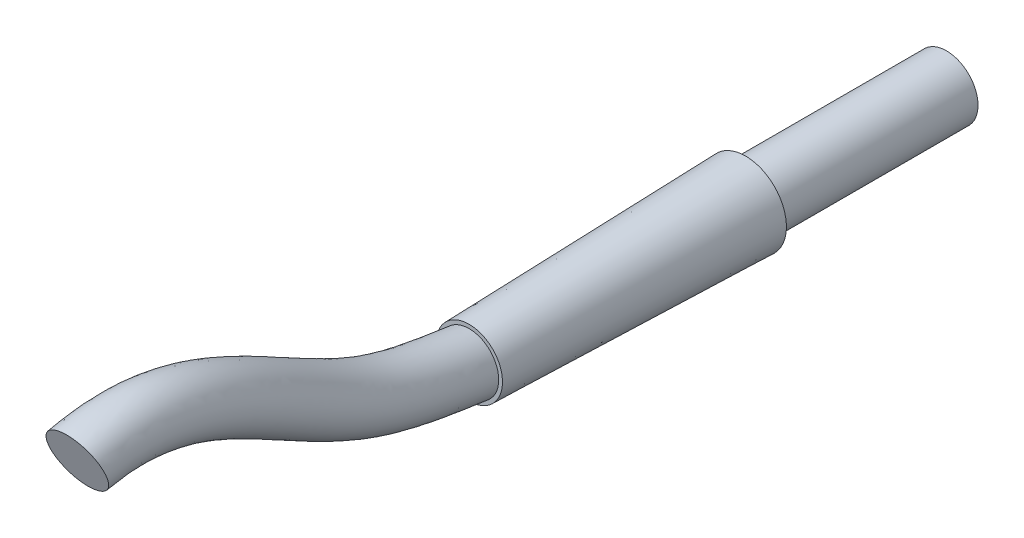
ISO-10303-21;
HEADER;
FILE_DESCRIPTION(('STEP AP214'),'2;1');
FILE_NAME('part.step','',(''),(''),'','','');
FILE_SCHEMA(('AUTOMOTIVE_DESIGN { 1 0 10303 214 1 1 1 1 }'));
ENDSEC;
DATA;
#1=APPLICATION_CONTEXT('core data for automotive mechanical design processes');
#2=APPLICATION_PROTOCOL_DEFINITION('international standard','automotive_design',2000,#1);
#3=PRODUCT_CONTEXT('',#1,'mechanical');
#4=PRODUCT('Part','Part','',(#3));
#5=PRODUCT_RELATED_PRODUCT_CATEGORY('part','',(#4));
#6=PRODUCT_DEFINITION_FORMATION('','',#4);
#7=PRODUCT_DEFINITION_CONTEXT('part definition',#1,'design');
#8=PRODUCT_DEFINITION('design','',#6,#7);
#9=PRODUCT_DEFINITION_SHAPE('','',#8);
#10=(LENGTH_UNIT() NAMED_UNIT(*) SI_UNIT(.MILLI.,.METRE.));
#11=(NAMED_UNIT(*) PLANE_ANGLE_UNIT() SI_UNIT($,.RADIAN.));
#12=(NAMED_UNIT(*) SI_UNIT($,.STERADIAN.) SOLID_ANGLE_UNIT());
#13=UNCERTAINTY_MEASURE_WITH_UNIT(LENGTH_MEASURE(1.E-05),#10,'distance_accuracy_value','');
#14=(GEOMETRIC_REPRESENTATION_CONTEXT(3) GLOBAL_UNCERTAINTY_ASSIGNED_CONTEXT((#13)) GLOBAL_UNIT_ASSIGNED_CONTEXT((#10,
#11,#12)) REPRESENTATION_CONTEXT('',''));
#15=CARTESIAN_POINT('',(0.,0.,0.));
#16=DIRECTION('',(0.,0.,1.));
#17=DIRECTION('',(1.,0.,0.));
#18=AXIS2_PLACEMENT_3D('',#15,#16,#17);
#19=CARTESIAN_POINT('',(0.,0.,0.));
#20=DIRECTION('',(0.,0.,1.));
#21=DIRECTION('',(1.,0.,0.));
#22=AXIS2_PLACEMENT_3D('',#19,#20,#21);
#23=PLANE('',#22);
#24=CARTESIAN_POINT('',(0.,0.,0.));
#25=DIRECTION('',(0.,0.,1.));
#26=DIRECTION('',(1.,0.,0.));
#27=AXIS2_PLACEMENT_3D('',#24,#25,#26);
#28=CIRCLE('',#27,2.5);
#29=CARTESIAN_POINT('',(2.5,0.,0.));
#30=VERTEX_POINT('',#29);
#31=EDGE_CURVE('E40',#30,#30,#28,.T.);
#32=ORIENTED_EDGE('',*,*,#31,.F.);
#33=EDGE_LOOP('',(#32));
#34=FACE_BOUND('',#33,.T.);
#35=CARTESIAN_POINT('',(0.,0.,0.));
#36=DIRECTION('',(0.,0.,1.));
#37=DIRECTION('',(1.,0.,0.));
#38=AXIS2_PLACEMENT_3D('',#35,#36,#37);
#39=CIRCLE('',#38,1.3);
#40=CARTESIAN_POINT('',(1.3,0.,0.));
#41=VERTEX_POINT('',#40);
#42=EDGE_CURVE('E63',#41,#41,#39,.T.);
#43=ORIENTED_EDGE('',*,*,#42,.T.);
#44=EDGE_LOOP('',(#43));
#45=FACE_BOUND('',#44,.T.);
#46=ADVANCED_FACE('F36',(#34,#45),#23,.F.);
#47=CARTESIAN_POINT('',(0.,0.,16.));
#48=DIRECTION('',(0.,0.,-1.));
#49=DIRECTION('',(-1.,0.,0.));
#50=AXIS2_PLACEMENT_3D('',#47,#48,#49);
#51=CYLINDRICAL_SURFACE('',#50,2.5);
#52=CARTESIAN_POINT('',(0.,0.,16.));
#53=DIRECTION('',(0.,0.,1.));
#54=DIRECTION('',(1.,0.,0.));
#55=AXIS2_PLACEMENT_3D('',#52,#53,#54);
#56=CIRCLE('',#55,2.5);
#57=CARTESIAN_POINT('',(2.5,0.,16.));
#58=VERTEX_POINT('',#57);
#59=EDGE_CURVE('E44',#58,#58,#56,.T.);
#60=ORIENTED_EDGE('',*,*,#59,.F.);
#61=EDGE_LOOP('',(#60));
#62=FACE_BOUND('',#61,.T.);
#63=ORIENTED_EDGE('',*,*,#31,.T.);
#64=EDGE_LOOP('',(#63));
#65=FACE_BOUND('',#64,.T.);
#66=ADVANCED_FACE('F38',(#62,#65),#51,.T.);
#67=CARTESIAN_POINT('',(0.,0.,16.));
#68=DIRECTION('',(0.,0.,-1.));
#69=DIRECTION('',(-1.,0.,0.));
#70=AXIS2_PLACEMENT_3D('',#67,#68,#69);
#71=CYLINDRICAL_SURFACE('',#70,1.3);
#72=CARTESIAN_POINT('',(0.,0.,16.));
#73=DIRECTION('',(0.,0.,1.));
#74=DIRECTION('',(1.,0.,0.));
#75=AXIS2_PLACEMENT_3D('',#72,#73,#74);
#76=CIRCLE('',#75,1.3);
#77=CARTESIAN_POINT('',(1.3,0.,16.));
#78=VERTEX_POINT('',#77);
#79=EDGE_CURVE('E60',#78,#78,#76,.T.);
#80=ORIENTED_EDGE('',*,*,#79,.T.);
#81=EDGE_LOOP('',(#80));
#82=FACE_BOUND('',#81,.T.);
#83=ORIENTED_EDGE('',*,*,#42,.F.);
#84=EDGE_LOOP('',(#83));
#85=FACE_BOUND('',#84,.T.);
#86=ADVANCED_FACE('F76',(#82,#85),#71,.F.);
#87=CARTESIAN_POINT('',(-3.25,0.,16.));
#88=DIRECTION('',(0.,0.,-1.));
#89=DIRECTION('',(-1.,0.,0.));
#90=AXIS2_PLACEMENT_3D('',#87,#88,#89);
#91=PLANE('',#90);
#92=ORIENTED_EDGE('',*,*,#79,.F.);
#93=EDGE_LOOP('',(#92));
#94=FACE_BOUND('',#93,.T.);
#95=ADVANCED_FACE('F78',(#94),#91,.T.);
#96=CARTESIAN_POINT('',(0.,0.,16.));
#97=DIRECTION('',(0.,0.,-1.));
#98=DIRECTION('',(-1.,0.,0.));
#99=AXIS2_PLACEMENT_3D('',#96,#97,#98);
#100=CONICAL_SURFACE('',#99,3.25,0.0272659684555946);
#101=CARTESIAN_POINT('',(0.,0.,38.));
#102=DIRECTION('',(0.,0.,-1.));
#103=DIRECTION('',(-1.,0.,0.));
#104=AXIS2_PLACEMENT_3D('',#101,#102,#103);
#105=CIRCLE('',#104,2.65);
#106=CARTESIAN_POINT('',(-2.65,0.,38.));
#107=VERTEX_POINT('',#106);
#108=EDGE_CURVE('E55',#107,#107,#105,.T.);
#109=ORIENTED_EDGE('',*,*,#108,.T.);
#110=EDGE_LOOP('',(#109));
#111=FACE_BOUND('',#110,.T.);
#112=CARTESIAN_POINT('',(0.,0.,16.));
#113=DIRECTION('',(0.,0.,-1.));
#114=DIRECTION('',(-1.,0.,0.));
#115=AXIS2_PLACEMENT_3D('',#112,#113,#114);
#116=CIRCLE('',#115,3.25);
#117=CARTESIAN_POINT('',(-3.25,0.,16.));
#118=VERTEX_POINT('',#117);
#119=EDGE_CURVE('E52',#118,#118,#116,.T.);
#120=ORIENTED_EDGE('',*,*,#119,.F.);
#121=EDGE_LOOP('',(#120));
#122=FACE_BOUND('',#121,.T.);
#123=ADVANCED_FACE('F85',(#111,#122),#100,.T.);
#124=CARTESIAN_POINT('',(-2.65,0.,38.));
#125=DIRECTION('',(0.,0.,1.));
#126=DIRECTION('',(1.,0.,0.));
#127=AXIS2_PLACEMENT_3D('',#124,#125,#126);
#128=PLANE('',#127);
#129=CARTESIAN_POINT('',(0.,0.,38.));
#130=DIRECTION('',(0.,0.,1.));
#131=DIRECTION('',(1.,0.,0.));
#132=AXIS2_PLACEMENT_3D('',#129,#130,#131);
#133=CIRCLE('',#132,2.35);
#134=CARTESIAN_POINT('',(2.35,0.,38.));
#135=VERTEX_POINT('',#134);
#136=EDGE_CURVE('E11',#135,#135,#133,.T.);
#137=ORIENTED_EDGE('',*,*,#136,.F.);
#138=EDGE_LOOP('',(#137));
#139=FACE_BOUND('',#138,.T.);
#140=ORIENTED_EDGE('',*,*,#108,.F.);
#141=EDGE_LOOP('',(#140));
#142=FACE_BOUND('',#141,.T.);
#143=ADVANCED_FACE('F93',(#139,#142),#128,.T.);
#144=ORIENTED_EDGE('',*,*,#59,.T.);
#145=EDGE_LOOP('',(#144));
#146=FACE_BOUND('',#145,.T.);
#147=ORIENTED_EDGE('',*,*,#119,.T.);
#148=EDGE_LOOP('',(#147));
#149=FACE_BOUND('',#148,.T.);
#150=ADVANCED_FACE('F88',(#146,#149),#91,.T.);
#151=CARTESIAN_POINT('',(0.,8.85086370550425,69.1894640782778));
#152=DIRECTION('',(0.,-0.360850723516981,0.932623587165407));
#153=DIRECTION('',(1.,0.,0.));
#154=AXIS2_PLACEMENT_3D('',#151,#152,#153);
#155=PLANE('',#154);
#156=CARTESIAN_POINT('',(0.,8.85086370550425,69.1894640782778));
#157=DIRECTION('',(0.,-0.360850723516981,0.932623587165407));
#158=DIRECTION('',(1.,0.,0.));
#159=AXIS2_PLACEMENT_3D('',#156,#157,#158);
#160=CIRCLE('',#159,2.35);
#161=CARTESIAN_POINT('',(2.35,8.85086370550425,69.1894640782778));
#162=VERTEX_POINT('',#161);
#163=EDGE_CURVE('E49',#162,#162,#160,.T.);
#164=ORIENTED_EDGE('',*,*,#163,.T.);
#165=EDGE_LOOP('',(#164));
#166=FACE_BOUND('',#165,.T.);
#167=ADVANCED_FACE('F50',(#166),#155,.T.);
#168=CARTESIAN_POINT('',(2.35,0.,38.));
#169=CARTESIAN_POINT('',(2.35,0.382917685191229,40.6216539179695));
#170=CARTESIAN_POINT('',(2.35,0.786232130769165,43.3021867400378));
#171=CARTESIAN_POINT('',(2.35,2.28256281143762,47.7538832187834));
#172=CARTESIAN_POINT('',(2.35,3.19256337368808,49.5912434196371));
#173=CARTESIAN_POINT('',(2.35,5.1249927569069,53.224666097579));
#174=CARTESIAN_POINT('',(2.35,6.1474215868881,55.0207285715829));
#175=CARTESIAN_POINT('',(2.35,7.89569800640815,58.7188614697592));
#176=CARTESIAN_POINT('',(2.35,8.6215456067298,60.6209318900412));
#177=CARTESIAN_POINT('',(2.35,9.36765007133316,64.6783863530319));
#178=CARTESIAN_POINT('',(2.35,9.38790694197741,66.8337703935628));
#179=CARTESIAN_POINT('',(2.35,8.85086370550425,69.1894640782778));
#180=CARTESIAN_POINT('',(2.35,4.7,38.));
#181=CARTESIAN_POINT('',(2.35,5.08291768526592,40.6078490444321));
#182=CARTESIAN_POINT('',(2.35,5.51005527387265,43.0113651462809));
#183=CARTESIAN_POINT('',(2.35,6.8313070669288,46.4966923683273));
#184=CARTESIAN_POINT('',(2.35,7.64802369489255,48.0922321345955));
#185=CARTESIAN_POINT('',(2.35,9.51955679022571,51.5555440324687));
#186=CARTESIAN_POINT('',(2.35,10.5720711718513,53.4175695035891));
#187=CARTESIAN_POINT('',(2.35,12.4606774262897,57.5749183635968));
#188=CARTESIAN_POINT('',(2.35,13.2976775900972,59.8864420405353));
#189=CARTESIAN_POINT('',(2.35,14.0851472066207,65.0668531091491));
#190=CARTESIAN_POINT('',(2.35,14.0046750580061,67.9264470425132));
#191=CARTESIAN_POINT('',(2.35,13.2341945651817,70.8854624788076));
#192=CARTESIAN_POINT('',(-2.35,4.7,38.));
#193=CARTESIAN_POINT('',(-2.35,5.08291768526592,40.6078490444321));
#194=CARTESIAN_POINT('',(-2.35,5.51005527387265,43.0113651462809));
#195=CARTESIAN_POINT('',(-2.35,6.8313070669288,46.4966923683273));
#196=CARTESIAN_POINT('',(-2.35,7.64802369489255,48.0922321345955));
#197=CARTESIAN_POINT('',(-2.35,9.51955679022571,51.5555440324687));
#198=CARTESIAN_POINT('',(-2.35,10.5720711718513,53.4175695035891));
#199=CARTESIAN_POINT('',(-2.35,12.4606774262897,57.5749183635968));
#200=CARTESIAN_POINT('',(-2.35,13.2976775900972,59.8864420405353));
#201=CARTESIAN_POINT('',(-2.35,14.0851472066207,65.0668531091491));
#202=CARTESIAN_POINT('',(-2.35,14.0046750580061,67.9264470425132));
#203=CARTESIAN_POINT('',(-2.35,13.2341945651817,70.8854624788076));
#204=CARTESIAN_POINT('',(-2.35,0.,38.));
#205=CARTESIAN_POINT('',(-2.35,0.38291768519123,40.6216539179695));
#206=CARTESIAN_POINT('',(-2.35,0.786232130769165,43.3021867400378));
#207=CARTESIAN_POINT('',(-2.35,2.28256281143762,47.7538832187834));
#208=CARTESIAN_POINT('',(-2.35,3.19256337368808,49.5912434196371));
#209=CARTESIAN_POINT('',(-2.35,5.1249927569069,53.224666097579));
#210=CARTESIAN_POINT('',(-2.35,6.1474215868881,55.0207285715829));
#211=CARTESIAN_POINT('',(-2.35,7.89569800640815,58.7188614697592));
#212=CARTESIAN_POINT('',(-2.35,8.62154560672981,60.6209318900412));
#213=CARTESIAN_POINT('',(-2.35,9.36765007133316,64.6783863530319));
#214=CARTESIAN_POINT('',(-2.35,9.38790694197741,66.8337703935628));
#215=CARTESIAN_POINT('',(-2.35,8.85086370550425,69.1894640782778));
#216=CARTESIAN_POINT('',(-2.35,-4.7,38.));
#217=CARTESIAN_POINT('',(-2.35,-4.31708231488346,40.6354587915069));
#218=CARTESIAN_POINT('',(-2.35,-3.93759101233432,43.5930083337947));
#219=CARTESIAN_POINT('',(-2.35,-2.26618144405356,49.0110740692396));
#220=CARTESIAN_POINT('',(-2.35,-1.2628969475164,51.0902547046787));
#221=CARTESIAN_POINT('',(-2.35,0.730428723588086,54.8937881626893));
#222=CARTESIAN_POINT('',(-2.35,1.7227720019249,56.6238876395767));
#223=CARTESIAN_POINT('',(-2.35,3.33071858652657,59.8628045759215));
#224=CARTESIAN_POINT('',(-2.35,3.94541362336238,61.3554217395471));
#225=CARTESIAN_POINT('',(-2.35,4.65015293604565,64.2899195969146));
#226=CARTESIAN_POINT('',(-2.35,4.77113882594874,65.7410937446125));
#227=CARTESIAN_POINT('',(-2.35,4.46753284582684,67.4934656777479));
#228=CARTESIAN_POINT('',(2.35,-4.7,38.));
#229=CARTESIAN_POINT('',(2.35,-4.31708231488346,40.6354587915069));
#230=CARTESIAN_POINT('',(2.35,-3.93759101233432,43.5930083337947));
#231=CARTESIAN_POINT('',(2.35,-2.26618144405356,49.0110740692396));
#232=CARTESIAN_POINT('',(2.35,-1.2628969475164,51.0902547046787));
#233=CARTESIAN_POINT('',(2.35,0.730428723588086,54.8937881626893));
#234=CARTESIAN_POINT('',(2.35,1.7227720019249,56.6238876395767));
#235=CARTESIAN_POINT('',(2.35,3.33071858652657,59.8628045759215));
#236=CARTESIAN_POINT('',(2.35,3.94541362336238,61.3554217395471));
#237=CARTESIAN_POINT('',(2.35,4.65015293604565,64.2899195969146));
#238=CARTESIAN_POINT('',(2.35,4.77113882594874,65.7410937446125));
#239=CARTESIAN_POINT('',(2.35,4.46753284582684,67.4934656777479));
#240=CARTESIAN_POINT('',(2.35,0.,38.));
#241=CARTESIAN_POINT('',(2.35,0.382917685191229,40.6216539179695));
#242=CARTESIAN_POINT('',(2.35,0.786232130769165,43.3021867400378));
#243=CARTESIAN_POINT('',(2.35,2.28256281143762,47.7538832187834));
#244=CARTESIAN_POINT('',(2.35,3.19256337368808,49.5912434196371));
#245=CARTESIAN_POINT('',(2.35,5.1249927569069,53.224666097579));
#246=CARTESIAN_POINT('',(2.35,6.1474215868881,55.0207285715829));
#247=CARTESIAN_POINT('',(2.35,7.89569800640815,58.7188614697592));
#248=CARTESIAN_POINT('',(2.35,8.6215456067298,60.6209318900412));
#249=CARTESIAN_POINT('',(2.35,9.36765007133316,64.6783863530319));
#250=CARTESIAN_POINT('',(2.35,9.38790694197741,66.8337703935628));
#251=CARTESIAN_POINT('',(2.35,8.85086370550425,69.1894640782778));
#252=(BOUNDED_SURFACE() B_SPLINE_SURFACE(3,3,((#168,#169,#170,#171,#172,#173,#174,#175,#176,
#177,#178,#179),(#180,#181,#182,#183,#184,#185,#186,#187,#188,#189,#190,#191),(#192,#193,#194,
#195,#196,#197,#198,#199,#200,#201,#202,#203),(#204,#205,#206,#207,#208,#209,#210,#211,#212,
#213,#214,#215),(#216,#217,#218,#219,#220,#221,#222,#223,#224,#225,#226,#227),(#228,#229,#230,
#231,#232,#233,#234,#235,#236,#237,#238,#239),(#240,#241,#242,#243,#244,#245,#246,#247,#248,
#249,#250,#251)),.UNSPECIFIED.,.T.,.F.,.F.) B_SPLINE_SURFACE_WITH_KNOTS((4,3,4),(4,2,2,2,2,4),
(0.,0.5,1.),(0.,0.24593663918741,0.434452479390558,0.622968319593705,0.811484159796853,1.),
.UNSPECIFIED.) GEOMETRIC_REPRESENTATION_ITEM() RATIONAL_B_SPLINE_SURFACE(((1.,1.,1.,1.,1.,1.,1.,
1.,1.,1.,1.,1.),(0.333333333333333,0.333333333333333,0.333333333333333,0.333333333333333,
0.333333333333333,0.333333333333333,0.333333333333333,0.333333333333333,0.333333333333333,
0.333333333333333,0.333333333333333,0.333333333333333),(0.333333333333333,0.333333333333333,
0.333333333333333,0.333333333333333,0.333333333333333,0.333333333333333,0.333333333333333,
0.333333333333333,0.333333333333333,0.333333333333333,0.333333333333333,0.333333333333333),(1.,
1.,1.,1.,1.,1.,1.,1.,1.,1.,1.,1.),(0.333333333333333,0.333333333333333,0.333333333333333,
0.333333333333333,0.333333333333333,0.333333333333333,0.333333333333333,0.333333333333333,
0.333333333333333,0.333333333333333,0.333333333333333,0.333333333333333),(0.333333333333333,
0.333333333333333,0.333333333333333,0.333333333333333,0.333333333333333,0.333333333333333,
0.333333333333333,0.333333333333333,0.333333333333333,0.333333333333333,0.333333333333333,
0.333333333333333),(1.,1.,1.,1.,1.,1.,1.,1.,1.,1.,1.,1.))) REPRESENTATION_ITEM('') SURFACE());
#253=ORIENTED_EDGE('',*,*,#163,.F.);
#254=EDGE_LOOP('',(#253));
#255=FACE_BOUND('',#254,.T.);
#256=ORIENTED_EDGE('',*,*,#136,.T.);
#257=EDGE_LOOP('',(#256));
#258=FACE_BOUND('',#257,.T.);
#259=ADVANCED_FACE('F99',(#255,#258),#252,.T.);
#260=CLOSED_SHELL('',(#46,#66,#86,#95,#123,#143,#150,#167,#259));
#261=MANIFOLD_SOLID_BREP('B2',#260);
#262=ADVANCED_BREP_SHAPE_REPRESENTATION('',(#18,#261),#14);
#263=SHAPE_DEFINITION_REPRESENTATION(#9,#262);
ENDSEC;
END-ISO-10303-21;
